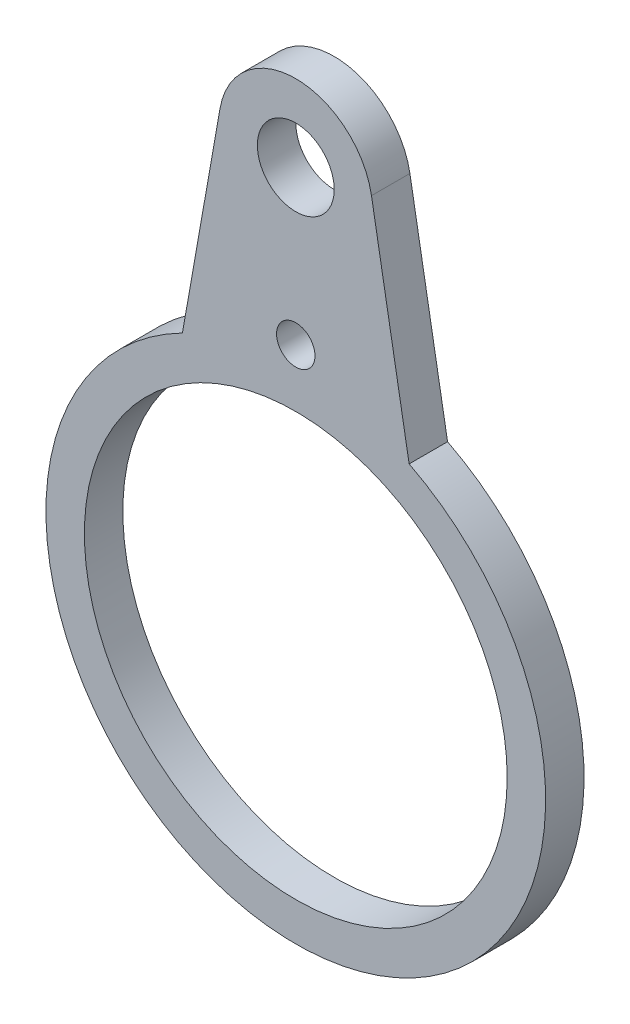
ISO-10303-21;
HEADER;
FILE_DESCRIPTION(('STEP AP214'),'2;1');
FILE_NAME('part.step','',(''),(''),'','','');
FILE_SCHEMA(('AUTOMOTIVE_DESIGN { 1 0 10303 214 1 1 1 1 }'));
ENDSEC;
DATA;
#1=APPLICATION_CONTEXT('core data for automotive mechanical design processes');
#2=APPLICATION_PROTOCOL_DEFINITION('international standard','automotive_design',2000,#1);
#3=PRODUCT_CONTEXT('',#1,'mechanical');
#4=PRODUCT('Part','Part','',(#3));
#5=PRODUCT_RELATED_PRODUCT_CATEGORY('part','',(#4));
#6=PRODUCT_DEFINITION_FORMATION('','',#4);
#7=PRODUCT_DEFINITION_CONTEXT('part definition',#1,'design');
#8=PRODUCT_DEFINITION('design','',#6,#7);
#9=PRODUCT_DEFINITION_SHAPE('','',#8);
#10=(LENGTH_UNIT() NAMED_UNIT(*) SI_UNIT(.MILLI.,.METRE.));
#11=(NAMED_UNIT(*) PLANE_ANGLE_UNIT() SI_UNIT($,.RADIAN.));
#12=(NAMED_UNIT(*) SI_UNIT($,.STERADIAN.) SOLID_ANGLE_UNIT());
#13=UNCERTAINTY_MEASURE_WITH_UNIT(LENGTH_MEASURE(1.E-05),#10,'distance_accuracy_value','');
#14=(GEOMETRIC_REPRESENTATION_CONTEXT(3) GLOBAL_UNCERTAINTY_ASSIGNED_CONTEXT((#13)) GLOBAL_UNIT_ASSIGNED_CONTEXT((#10,
#11,#12)) REPRESENTATION_CONTEXT('',''));
#15=CARTESIAN_POINT('',(0.,0.,0.));
#16=DIRECTION('',(0.,0.,1.));
#17=DIRECTION('',(1.,0.,0.));
#18=AXIS2_PLACEMENT_3D('',#15,#16,#17);
#19=CARTESIAN_POINT('',(0.,0.,-97.6477631085024));
#20=DIRECTION('',(0.,0.,1.));
#21=DIRECTION('',(1.,0.,0.));
#22=AXIS2_PLACEMENT_3D('',#19,#20,#21);
#23=CYLINDRICAL_SURFACE('',#22,65.);
#24=CARTESIAN_POINT('',(0.,0.,96.2));
#25=DIRECTION('',(0.,0.,1.));
#26=DIRECTION('',(1.,0.,0.));
#27=AXIS2_PLACEMENT_3D('',#24,#25,#26);
#28=CIRCLE('',#27,65.);
#29=CARTESIAN_POINT('',(-29.4907773759643,57.924900084172,96.2));
#30=VERTEX_POINT('',#29);
#31=CARTESIAN_POINT('',(29.4907773759643,57.924900084172,96.2));
#32=VERTEX_POINT('',#31);
#33=EDGE_CURVE('E129',#30,#32,#28,.T.);
#34=ORIENTED_EDGE('',*,*,#33,.F.);
#35=DIRECTION('',(0.,0.,1.));
#36=VECTOR('',#35,1.);
#37=CARTESIAN_POINT('',(-29.4907773759643,57.924900084172,-6.93239945814422));
#38=LINE('',#37,#36);
#39=CARTESIAN_POINT('',(-29.4907773759643,57.924900084172,86.2));
#40=VERTEX_POINT('',#39);
#41=EDGE_CURVE('E93',#40,#30,#38,.T.);
#42=ORIENTED_EDGE('',*,*,#41,.F.);
#43=CARTESIAN_POINT('',(0.,0.,86.2));
#44=DIRECTION('',(0.,0.,1.));
#45=DIRECTION('',(1.,0.,0.));
#46=AXIS2_PLACEMENT_3D('',#43,#44,#45);
#47=CIRCLE('',#46,65.);
#48=CARTESIAN_POINT('',(29.4907773759643,57.924900084172,86.2));
#49=VERTEX_POINT('',#48);
#50=EDGE_CURVE('E50',#49,#40,#47,.F.);
#51=ORIENTED_EDGE('',*,*,#50,.F.);
#52=DIRECTION('',(0.,0.,1.));
#53=VECTOR('',#52,1.);
#54=CARTESIAN_POINT('',(29.4907773759643,57.924900084172,-6.93239945814422));
#55=LINE('',#54,#53);
#56=EDGE_CURVE('E57',#49,#32,#55,.T.);
#57=ORIENTED_EDGE('',*,*,#56,.T.);
#58=EDGE_LOOP('',(#34,#42,#51,#57));
#59=FACE_BOUND('',#58,.T.);
#60=ADVANCED_FACE('F42',(#59),#23,.T.);
#61=CARTESIAN_POINT('',(0.,70.,10.));
#62=DIRECTION('',(0.,0.,-1.));
#63=DIRECTION('',(-1.,0.,0.));
#64=AXIS2_PLACEMENT_3D('',#61,#62,#63);
#65=CYLINDRICAL_SURFACE('',#64,5.);
#66=CARTESIAN_POINT('',(0.,70.,96.2));
#67=DIRECTION('',(0.,0.,1.));
#68=DIRECTION('',(1.,0.,0.));
#69=AXIS2_PLACEMENT_3D('',#66,#67,#68);
#70=CIRCLE('',#69,5.);
#71=CARTESIAN_POINT('',(5.,70.,96.2));
#72=VERTEX_POINT('',#71);
#73=EDGE_CURVE('E11',#72,#72,#70,.T.);
#74=ORIENTED_EDGE('',*,*,#73,.T.);
#75=EDGE_LOOP('',(#74));
#76=FACE_BOUND('',#75,.T.);
#77=CARTESIAN_POINT('',(0.,70.,86.2));
#78=DIRECTION('',(0.,0.,-1.));
#79=DIRECTION('',(-1.,0.,0.));
#80=AXIS2_PLACEMENT_3D('',#77,#78,#79);
#81=CIRCLE('',#80,5.);
#82=CARTESIAN_POINT('',(-5.,70.,86.2));
#83=VERTEX_POINT('',#82);
#84=EDGE_CURVE('E119',#83,#83,#81,.T.);
#85=ORIENTED_EDGE('',*,*,#84,.T.);
#86=EDGE_LOOP('',(#85));
#87=FACE_BOUND('',#86,.T.);
#88=ADVANCED_FACE('F44',(#76,#87),#65,.F.);
#89=CARTESIAN_POINT('',(0.,70.,86.2));
#90=DIRECTION('',(0.,0.,1.));
#91=DIRECTION('',(1.,0.,0.));
#92=AXIS2_PLACEMENT_3D('',#89,#90,#91);
#93=PLANE('',#92);
#94=CARTESIAN_POINT('',(0.,0.,86.2));
#95=DIRECTION('',(0.,0.,1.));
#96=DIRECTION('',(1.,0.,0.));
#97=AXIS2_PLACEMENT_3D('',#94,#95,#96);
#98=CIRCLE('',#97,55.);
#99=CARTESIAN_POINT('',(55.,0.,86.2));
#100=VERTEX_POINT('',#99);
#101=EDGE_CURVE('E126',#100,#100,#98,.F.);
#102=ORIENTED_EDGE('',*,*,#101,.F.);
#103=EDGE_LOOP('',(#102));
#104=FACE_BOUND('',#103,.T.);
#105=ORIENTED_EDGE('',*,*,#50,.T.);
#106=DIRECTION('',(-0.173648177666927,-0.984807753012209,0.));
#107=VECTOR('',#106,1.);
#108=CARTESIAN_POINT('',(-38.5072629431556,6.78986941011348,86.2));
#109=LINE('',#108,#107);
#110=CARTESIAN_POINT('',(-19.6961550602442,113.472963553339,86.2));
#111=VERTEX_POINT('',#110);
#112=EDGE_CURVE('E66',#111,#40,#109,.T.);
#113=ORIENTED_EDGE('',*,*,#112,.F.);
#114=CARTESIAN_POINT('',(0.,110.,86.2));
#115=DIRECTION('',(0.,0.,1.));
#116=DIRECTION('',(1.,0.,0.));
#117=AXIS2_PLACEMENT_3D('',#114,#115,#116);
#118=CIRCLE('',#117,20.);
#119=CARTESIAN_POINT('',(19.6961550602442,113.472963553339,86.2));
#120=VERTEX_POINT('',#119);
#121=EDGE_CURVE('E91',#120,#111,#118,.T.);
#122=ORIENTED_EDGE('',*,*,#121,.F.);
#123=DIRECTION('',(0.173648177666927,-0.984807753012209,0.));
#124=VECTOR('',#123,1.);
#125=CARTESIAN_POINT('',(38.5072629431556,6.78986941011348,86.2));
#126=LINE('',#125,#124);
#127=EDGE_CURVE('E118',#120,#49,#126,.T.);
#128=ORIENTED_EDGE('',*,*,#127,.T.);
#129=EDGE_LOOP('',(#105,#113,#122,#128));
#130=FACE_BOUND('',#129,.T.);
#131=ORIENTED_EDGE('',*,*,#84,.F.);
#132=EDGE_LOOP('',(#131));
#133=FACE_BOUND('',#132,.T.);
#134=CARTESIAN_POINT('',(0.,110.,86.2));
#135=DIRECTION('',(0.,0.,1.));
#136=DIRECTION('',(1.,0.,0.));
#137=AXIS2_PLACEMENT_3D('',#134,#135,#136);
#138=CIRCLE('',#137,10.);
#139=CARTESIAN_POINT('',(10.,110.,86.2));
#140=VERTEX_POINT('',#139);
#141=EDGE_CURVE('E123',#140,#140,#138,.F.);
#142=ORIENTED_EDGE('',*,*,#141,.F.);
#143=EDGE_LOOP('',(#142));
#144=FACE_BOUND('',#143,.T.);
#145=ADVANCED_FACE('F131',(#104,#130,#133,#144),#93,.F.);
#146=CARTESIAN_POINT('',(0.,70.,96.2));
#147=DIRECTION('',(0.,0.,1.));
#148=DIRECTION('',(1.,0.,0.));
#149=AXIS2_PLACEMENT_3D('',#146,#147,#148);
#150=PLANE('',#149);
#151=DIRECTION('',(0.173648177666927,0.984807753012209,0.));
#152=VECTOR('',#151,1.);
#153=CARTESIAN_POINT('',(-38.5072629431556,6.78986941011348,96.2));
#154=LINE('',#153,#152);
#155=CARTESIAN_POINT('',(-19.6961550602442,113.472963553339,96.2));
#156=VERTEX_POINT('',#155);
#157=EDGE_CURVE('E97',#30,#156,#154,.T.);
#158=ORIENTED_EDGE('',*,*,#157,.F.);
#159=ORIENTED_EDGE('',*,*,#33,.T.);
#160=DIRECTION('',(-0.173648177666927,0.984807753012209,0.));
#161=VECTOR('',#160,1.);
#162=CARTESIAN_POINT('',(38.5072629431556,6.78986941011348,96.2));
#163=LINE('',#162,#161);
#164=CARTESIAN_POINT('',(19.6961550602442,113.472963553339,96.2));
#165=VERTEX_POINT('',#164);
#166=EDGE_CURVE('E94',#32,#165,#163,.T.);
#167=ORIENTED_EDGE('',*,*,#166,.T.);
#168=CARTESIAN_POINT('',(0.,110.,96.2));
#169=DIRECTION('',(0.,0.,1.));
#170=DIRECTION('',(1.,0.,0.));
#171=AXIS2_PLACEMENT_3D('',#168,#169,#170);
#172=CIRCLE('',#171,20.);
#173=EDGE_CURVE('E89',#156,#165,#172,.F.);
#174=ORIENTED_EDGE('',*,*,#173,.F.);
#175=EDGE_LOOP('',(#158,#159,#167,#174));
#176=FACE_BOUND('',#175,.T.);
#177=CARTESIAN_POINT('',(0.,0.,96.2));
#178=DIRECTION('',(0.,0.,1.));
#179=DIRECTION('',(1.,0.,0.));
#180=AXIS2_PLACEMENT_3D('',#177,#178,#179);
#181=CIRCLE('',#180,55.);
#182=CARTESIAN_POINT('',(55.,0.,96.2));
#183=VERTEX_POINT('',#182);
#184=EDGE_CURVE('E122',#183,#183,#181,.T.);
#185=ORIENTED_EDGE('',*,*,#184,.F.);
#186=EDGE_LOOP('',(#185));
#187=FACE_BOUND('',#186,.T.);
#188=ORIENTED_EDGE('',*,*,#73,.F.);
#189=EDGE_LOOP('',(#188));
#190=FACE_BOUND('',#189,.T.);
#191=CARTESIAN_POINT('',(0.,110.,96.2));
#192=DIRECTION('',(0.,0.,1.));
#193=DIRECTION('',(1.,0.,0.));
#194=AXIS2_PLACEMENT_3D('',#191,#192,#193);
#195=CIRCLE('',#194,10.);
#196=CARTESIAN_POINT('',(10.,110.,96.2));
#197=VERTEX_POINT('',#196);
#198=EDGE_CURVE('E106',#197,#197,#195,.T.);
#199=ORIENTED_EDGE('',*,*,#198,.F.);
#200=EDGE_LOOP('',(#199));
#201=FACE_BOUND('',#200,.T.);
#202=ADVANCED_FACE('F104',(#176,#187,#190,#201),#150,.T.);
#203=CARTESIAN_POINT('',(0.,0.,-69.3634918610405));
#204=DIRECTION('',(0.,0.,1.));
#205=DIRECTION('',(1.,0.,0.));
#206=AXIS2_PLACEMENT_3D('',#203,#204,#205);
#207=CYLINDRICAL_SURFACE('',#206,55.);
#208=ORIENTED_EDGE('',*,*,#101,.T.);
#209=EDGE_LOOP('',(#208));
#210=FACE_BOUND('',#209,.T.);
#211=ORIENTED_EDGE('',*,*,#184,.T.);
#212=EDGE_LOOP('',(#211));
#213=FACE_BOUND('',#212,.T.);
#214=ADVANCED_FACE('F143',(#210,#213),#207,.F.);
#215=CARTESIAN_POINT('',(0.,110.,-6.93239945814422));
#216=DIRECTION('',(0.,0.,1.));
#217=DIRECTION('',(1.,0.,0.));
#218=AXIS2_PLACEMENT_3D('',#215,#216,#217);
#219=CYLINDRICAL_SURFACE('',#218,10.);
#220=CARTESIAN_POINT('',(10.,110.,86.2));
#221=CARTESIAN_POINT('',(10.,110.,86.3041666666667));
#222=CARTESIAN_POINT('',(10.,110.,86.4083333333333));
#223=CARTESIAN_POINT('',(10.,110.,86.6166666666666));
#224=CARTESIAN_POINT('',(10.,110.,86.7208333333333));
#225=CARTESIAN_POINT('',(10.,110.,86.9291666666667));
#226=CARTESIAN_POINT('',(10.,110.,87.0333333333333));
#227=CARTESIAN_POINT('',(10.,110.,87.2416666666667));
#228=CARTESIAN_POINT('',(10.,110.,87.3458333333333));
#229=CARTESIAN_POINT('',(10.,110.,87.5541666666667));
#230=CARTESIAN_POINT('',(10.,110.,87.6583333333333));
#231=CARTESIAN_POINT('',(10.,110.,87.8666666666666));
#232=CARTESIAN_POINT('',(10.,110.,87.9708333333333));
#233=CARTESIAN_POINT('',(10.,110.,88.1791666666667));
#234=CARTESIAN_POINT('',(10.,110.,88.2833333333333));
#235=CARTESIAN_POINT('',(10.,110.,88.4916666666667));
#236=CARTESIAN_POINT('',(10.,110.,88.5958333333333));
#237=CARTESIAN_POINT('',(10.,110.,88.8041666666667));
#238=CARTESIAN_POINT('',(10.,110.,88.9083333333333));
#239=CARTESIAN_POINT('',(10.,110.,89.1166666666666));
#240=CARTESIAN_POINT('',(10.,110.,89.2208333333333));
#241=CARTESIAN_POINT('',(10.,110.,89.4291666666667));
#242=CARTESIAN_POINT('',(10.,110.,89.5333333333333));
#243=CARTESIAN_POINT('',(10.,110.,89.7416666666667));
#244=CARTESIAN_POINT('',(10.,110.,89.8458333333333));
#245=CARTESIAN_POINT('',(10.,110.,90.0541666666667));
#246=CARTESIAN_POINT('',(10.,110.,90.1583333333333));
#247=CARTESIAN_POINT('',(10.,110.,90.3666666666666));
#248=CARTESIAN_POINT('',(10.,110.,90.4708333333333));
#249=CARTESIAN_POINT('',(10.,110.,90.6791666666667));
#250=CARTESIAN_POINT('',(10.,110.,90.7833333333333));
#251=CARTESIAN_POINT('',(10.,110.,90.9916666666667));
#252=CARTESIAN_POINT('',(10.,110.,91.0958333333333));
#253=CARTESIAN_POINT('',(10.,110.,91.3041666666667));
#254=CARTESIAN_POINT('',(10.,110.,91.4083333333333));
#255=CARTESIAN_POINT('',(10.,110.,91.6166666666666));
#256=CARTESIAN_POINT('',(10.,110.,91.7208333333333));
#257=CARTESIAN_POINT('',(10.,110.,91.9291666666667));
#258=CARTESIAN_POINT('',(10.,110.,92.0333333333333));
#259=CARTESIAN_POINT('',(10.,110.,92.2416666666667));
#260=CARTESIAN_POINT('',(10.,110.,92.3458333333333));
#261=CARTESIAN_POINT('',(10.,110.,92.5541666666667));
#262=CARTESIAN_POINT('',(10.,110.,92.6583333333333));
#263=CARTESIAN_POINT('',(10.,110.,92.8666666666666));
#264=CARTESIAN_POINT('',(10.,110.,92.9708333333333));
#265=CARTESIAN_POINT('',(10.,110.,93.1791666666667));
#266=CARTESIAN_POINT('',(10.,110.,93.2833333333333));
#267=CARTESIAN_POINT('',(10.,110.,93.4916666666667));
#268=CARTESIAN_POINT('',(10.,110.,93.5958333333333));
#269=CARTESIAN_POINT('',(10.,110.,93.8041666666667));
#270=CARTESIAN_POINT('',(10.,110.,93.9083333333333));
#271=CARTESIAN_POINT('',(10.,110.,94.1166666666667));
#272=CARTESIAN_POINT('',(10.,110.,94.2208333333333));
#273=CARTESIAN_POINT('',(10.,110.,94.4291666666667));
#274=CARTESIAN_POINT('',(10.,110.,94.5333333333333));
#275=CARTESIAN_POINT('',(10.,110.,94.7416666666667));
#276=CARTESIAN_POINT('',(10.,110.,94.8458333333333));
#277=CARTESIAN_POINT('',(10.,110.,95.0541666666667));
#278=CARTESIAN_POINT('',(10.,110.,95.1583333333333));
#279=CARTESIAN_POINT('',(10.,110.,95.3666666666667));
#280=CARTESIAN_POINT('',(10.,110.,95.4708333333333));
#281=CARTESIAN_POINT('',(10.,110.,95.6791666666667));
#282=CARTESIAN_POINT('',(10.,110.,95.7833333333333));
#283=CARTESIAN_POINT('',(10.,110.,95.9916666666667));
#284=CARTESIAN_POINT('',(10.,110.,96.0958333333333));
#285=CARTESIAN_POINT('',(10.,110.,96.2));
#286=B_SPLINE_CURVE_WITH_KNOTS('',3,(#220,#221,#222,#223,#224,#225,#226,#227,#228,#229,#230,
#231,#232,#233,#234,#235,#236,#237,#238,#239,#240,#241,#242,#243,#244,#245,#246,#247,#248,#249,
#250,#251,#252,#253,#254,#255,#256,#257,#258,#259,#260,#261,#262,#263,#264,#265,#266,#267,#268,
#269,#270,#271,#272,#273,#274,#275,#276,#277,#278,#279,#280,#281,#282,#283,#284,#285),
.UNSPECIFIED.,.F.,.F.,(4,2,2,2,2,2,2,2,2,2,2,2,2,2,2,2,2,2,2,2,2,2,2,2,2,2,2,2,2,2,2,2,4),(0.,
0.312499999999993,0.625000000000001,0.937500000000008,1.25,1.56249999999999,1.875,
2.18750000000001,2.5,2.8125,3.125,3.43750000000001,3.75,4.0625,4.375,4.68750000000001,5.,5.3125,
5.62500000000001,5.93750000000001,6.25000000000001,6.5625,6.87500000000001,7.18750000000001,
7.50000000000001,7.8125,8.12500000000001,8.43750000000001,8.75000000000001,9.0625,
9.37500000000001,9.68750000000002,10.),.UNSPECIFIED.);
#287=EDGE_CURVE('BSEAM153',#140,#197,#286,.T.);
#288=ORIENTED_EDGE('',*,*,#141,.T.);
#289=ORIENTED_EDGE('',*,*,#198,.T.);
#290=ORIENTED_EDGE('',*,*,#287,.T.);
#291=ORIENTED_EDGE('',*,*,#287,.F.);
#292=EDGE_LOOP('',(#288,#290,#289,#291));
#293=FACE_BOUND('',#292,.T.);
#294=ADVANCED_FACE('F153',(#293),#219,.F.);
#295=CARTESIAN_POINT('',(-38.5072629431556,6.78986941011348,-6.93239945814422));
#296=DIRECTION('',(0.984807753012209,-0.173648177666927,0.));
#297=DIRECTION('',(0.173648177666927,0.984807753012209,0.));
#298=AXIS2_PLACEMENT_3D('',#295,#296,#297);
#299=PLANE('',#298);
#300=DIRECTION('',(0.,0.,1.));
#301=VECTOR('',#300,1.);
#302=CARTESIAN_POINT('',(-19.6961550602442,113.472963553339,-6.93239945814422));
#303=LINE('',#302,#301);
#304=EDGE_CURVE('E84',#111,#156,#303,.T.);
#305=ORIENTED_EDGE('',*,*,#304,.F.);
#306=ORIENTED_EDGE('',*,*,#112,.T.);
#307=ORIENTED_EDGE('',*,*,#41,.T.);
#308=ORIENTED_EDGE('',*,*,#157,.T.);
#309=EDGE_LOOP('',(#305,#306,#307,#308));
#310=FACE_BOUND('',#309,.T.);
#311=ADVANCED_FACE('F98',(#310),#299,.F.);
#312=CARTESIAN_POINT('',(38.5072629431556,6.78986941011348,-6.93239945814422));
#313=DIRECTION('',(0.984807753012209,0.173648177666927,0.));
#314=DIRECTION('',(-0.173648177666927,0.984807753012209,0.));
#315=AXIS2_PLACEMENT_3D('',#312,#313,#314);
#316=PLANE('',#315);
#317=ORIENTED_EDGE('',*,*,#127,.F.);
#318=DIRECTION('',(0.,0.,1.));
#319=VECTOR('',#318,1.);
#320=CARTESIAN_POINT('',(19.6961550602442,113.472963553339,-6.93239945814422));
#321=LINE('',#320,#319);
#322=EDGE_CURVE('E113',#120,#165,#321,.T.);
#323=ORIENTED_EDGE('',*,*,#322,.T.);
#324=ORIENTED_EDGE('',*,*,#166,.F.);
#325=ORIENTED_EDGE('',*,*,#56,.F.);
#326=EDGE_LOOP('',(#317,#323,#324,#325));
#327=FACE_BOUND('',#326,.T.);
#328=ADVANCED_FACE('F165',(#327),#316,.T.);
#329=CARTESIAN_POINT('',(0.,110.,-6.93239945814422));
#330=DIRECTION('',(0.,0.,1.));
#331=DIRECTION('',(1.,0.,0.));
#332=AXIS2_PLACEMENT_3D('',#329,#330,#331);
#333=CYLINDRICAL_SURFACE('',#332,20.);
#334=ORIENTED_EDGE('',*,*,#322,.F.);
#335=ORIENTED_EDGE('',*,*,#121,.T.);
#336=ORIENTED_EDGE('',*,*,#304,.T.);
#337=ORIENTED_EDGE('',*,*,#173,.T.);
#338=EDGE_LOOP('',(#334,#335,#336,#337));
#339=FACE_BOUND('',#338,.T.);
#340=ADVANCED_FACE('F87',(#339),#333,.T.);
#341=CLOSED_SHELL('',(#60,#88,#145,#202,#214,#294,#311,#328,#340));
#342=MANIFOLD_SOLID_BREP('B2',#341);
#343=ADVANCED_BREP_SHAPE_REPRESENTATION('',(#18,#342),#14);
#344=SHAPE_DEFINITION_REPRESENTATION(#9,#343);
ENDSEC;
END-ISO-10303-21;
